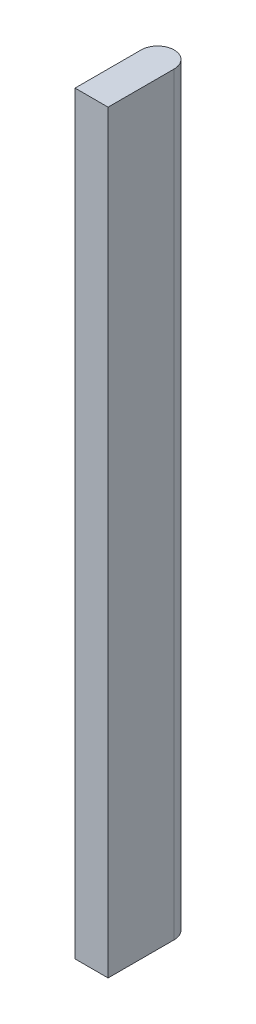
ISO-10303-21;
HEADER;
FILE_DESCRIPTION(('STEP AP214'),'2;1');
FILE_NAME('part.step','',(''),(''),'','','');
FILE_SCHEMA(('AUTOMOTIVE_DESIGN { 1 0 10303 214 1 1 1 1 }'));
ENDSEC;
DATA;
#1=APPLICATION_CONTEXT('core data for automotive mechanical design processes');
#2=APPLICATION_PROTOCOL_DEFINITION('international standard','automotive_design',2000,#1);
#3=PRODUCT_CONTEXT('',#1,'mechanical');
#4=PRODUCT('Part','Part','',(#3));
#5=PRODUCT_RELATED_PRODUCT_CATEGORY('part','',(#4));
#6=PRODUCT_DEFINITION_FORMATION('','',#4);
#7=PRODUCT_DEFINITION_CONTEXT('part definition',#1,'design');
#8=PRODUCT_DEFINITION('design','',#6,#7);
#9=PRODUCT_DEFINITION_SHAPE('','',#8);
#10=(LENGTH_UNIT() NAMED_UNIT(*) SI_UNIT(.MILLI.,.METRE.));
#11=(NAMED_UNIT(*) PLANE_ANGLE_UNIT() SI_UNIT($,.RADIAN.));
#12=(NAMED_UNIT(*) SI_UNIT($,.STERADIAN.) SOLID_ANGLE_UNIT());
#13=UNCERTAINTY_MEASURE_WITH_UNIT(LENGTH_MEASURE(1.E-05),#10,'distance_accuracy_value','');
#14=(GEOMETRIC_REPRESENTATION_CONTEXT(3) GLOBAL_UNCERTAINTY_ASSIGNED_CONTEXT((#13)) GLOBAL_UNIT_ASSIGNED_CONTEXT((#10,
#11,#12)) REPRESENTATION_CONTEXT('',''));
#15=CARTESIAN_POINT('',(0.,0.,0.));
#16=DIRECTION('',(0.,0.,1.));
#17=DIRECTION('',(1.,0.,0.));
#18=AXIS2_PLACEMENT_3D('',#15,#16,#17);
#19=CARTESIAN_POINT('',(0.,145.,0.));
#20=DIRECTION('',(1.,0.,0.));
#21=DIRECTION('',(0.,0.,-1.));
#22=AXIS2_PLACEMENT_3D('',#19,#20,#21);
#23=PLANE('',#22);
#24=DIRECTION('',(0.,0.,1.));
#25=VECTOR('',#24,1.);
#26=CARTESIAN_POINT('',(0.,0.,0.));
#27=LINE('',#26,#25);
#28=CARTESIAN_POINT('',(0.,0.,-12.705));
#29=VERTEX_POINT('',#28);
#30=CARTESIAN_POINT('',(0.,0.,0.));
#31=VERTEX_POINT('',#30);
#32=EDGE_CURVE('E118',#29,#31,#27,.T.);
#33=ORIENTED_EDGE('',*,*,#32,.T.);
#34=DIRECTION('',(0.,-1.,0.));
#35=VECTOR('',#34,1.);
#36=CARTESIAN_POINT('',(0.,145.,0.));
#37=LINE('',#36,#35);
#38=CARTESIAN_POINT('',(0.,145.,0.));
#39=VERTEX_POINT('',#38);
#40=EDGE_CURVE('E11',#39,#31,#37,.T.);
#41=ORIENTED_EDGE('',*,*,#40,.F.);
#42=DIRECTION('',(0.,0.,1.));
#43=VECTOR('',#42,1.);
#44=CARTESIAN_POINT('',(0.,145.,0.));
#45=LINE('',#44,#43);
#46=CARTESIAN_POINT('',(0.,145.,-12.705));
#47=VERTEX_POINT('',#46);
#48=EDGE_CURVE('E128',#47,#39,#45,.T.);
#49=ORIENTED_EDGE('',*,*,#48,.F.);
#50=DIRECTION('',(0.,-1.,0.));
#51=VECTOR('',#50,1.);
#52=CARTESIAN_POINT('',(0.,145.,-12.705));
#53=LINE('',#52,#51);
#54=EDGE_CURVE('E114',#47,#29,#53,.T.);
#55=ORIENTED_EDGE('',*,*,#54,.T.);
#56=EDGE_LOOP('',(#33,#41,#49,#55));
#57=FACE_BOUND('',#56,.T.);
#58=ADVANCED_FACE('F34',(#57),#23,.F.);
#59=CARTESIAN_POINT('',(0.,145.,0.));
#60=DIRECTION('',(0.,0.,-1.));
#61=DIRECTION('',(-1.,0.,0.));
#62=AXIS2_PLACEMENT_3D('',#59,#60,#61);
#63=PLANE('',#62);
#64=DIRECTION('',(1.,0.,0.));
#65=VECTOR('',#64,1.);
#66=CARTESIAN_POINT('',(0.,0.,0.));
#67=LINE('',#66,#65);
#68=CARTESIAN_POINT('',(6.35,0.,0.));
#69=VERTEX_POINT('',#68);
#70=EDGE_CURVE('E121',#31,#69,#67,.T.);
#71=ORIENTED_EDGE('',*,*,#70,.T.);
#72=DIRECTION('',(0.,-1.,0.));
#73=VECTOR('',#72,1.);
#74=CARTESIAN_POINT('',(6.35,145.,0.));
#75=LINE('',#74,#73);
#76=CARTESIAN_POINT('',(6.35,145.,0.));
#77=VERTEX_POINT('',#76);
#78=EDGE_CURVE('E42',#77,#69,#75,.T.);
#79=ORIENTED_EDGE('',*,*,#78,.F.);
#80=DIRECTION('',(1.,0.,0.));
#81=VECTOR('',#80,1.);
#82=CARTESIAN_POINT('',(0.,145.,0.));
#83=LINE('',#82,#81);
#84=EDGE_CURVE('E87',#39,#77,#83,.T.);
#85=ORIENTED_EDGE('',*,*,#84,.F.);
#86=ORIENTED_EDGE('',*,*,#40,.T.);
#87=EDGE_LOOP('',(#71,#79,#85,#86));
#88=FACE_BOUND('',#87,.T.);
#89=ADVANCED_FACE('F152',(#88),#63,.F.);
#90=CARTESIAN_POINT('',(6.35,145.,0.));
#91=DIRECTION('',(-1.,0.,0.));
#92=DIRECTION('',(0.,0.,1.));
#93=AXIS2_PLACEMENT_3D('',#90,#91,#92);
#94=PLANE('',#93);
#95=DIRECTION('',(0.,0.,-1.));
#96=VECTOR('',#95,1.);
#97=CARTESIAN_POINT('',(6.35,0.,0.));
#98=LINE('',#97,#96);
#99=CARTESIAN_POINT('',(6.35,0.,-12.705));
#100=VERTEX_POINT('',#99);
#101=EDGE_CURVE('E123',#69,#100,#98,.T.);
#102=ORIENTED_EDGE('',*,*,#101,.T.);
#103=DIRECTION('',(0.,-1.,0.));
#104=VECTOR('',#103,1.);
#105=CARTESIAN_POINT('',(6.35,145.,-12.705));
#106=LINE('',#105,#104);
#107=CARTESIAN_POINT('',(6.35,145.,-12.705));
#108=VERTEX_POINT('',#107);
#109=EDGE_CURVE('E109',#108,#100,#106,.T.);
#110=ORIENTED_EDGE('',*,*,#109,.F.);
#111=DIRECTION('',(0.,0.,-1.));
#112=VECTOR('',#111,1.);
#113=CARTESIAN_POINT('',(6.35,145.,0.));
#114=LINE('',#113,#112);
#115=EDGE_CURVE('E100',#77,#108,#114,.T.);
#116=ORIENTED_EDGE('',*,*,#115,.F.);
#117=ORIENTED_EDGE('',*,*,#78,.T.);
#118=EDGE_LOOP('',(#102,#110,#116,#117));
#119=FACE_BOUND('',#118,.T.);
#120=ADVANCED_FACE('F134',(#119),#94,.F.);
#121=CARTESIAN_POINT('',(3.18,145.,-12.705));
#122=DIRECTION('',(0.,-1.,0.));
#123=DIRECTION('',(0.,0.,-1.));
#124=AXIS2_PLACEMENT_3D('',#121,#122,#123);
#125=CYLINDRICAL_SURFACE('',#124,3.17);
#126=CARTESIAN_POINT('',(3.18,0.,-12.705));
#127=DIRECTION('',(0.,1.,0.));
#128=DIRECTION('',(0.,0.,-1.));
#129=AXIS2_PLACEMENT_3D('',#126,#127,#128);
#130=CIRCLE('',#129,3.17);
#131=CARTESIAN_POINT('',(3.17999999999997,0.,-15.875));
#132=VERTEX_POINT('',#131);
#133=EDGE_CURVE('E108',#100,#132,#130,.T.);
#134=ORIENTED_EDGE('',*,*,#133,.T.);
#135=DIRECTION('',(0.,-1.,0.));
#136=VECTOR('',#135,1.);
#137=CARTESIAN_POINT('',(3.17999999999997,145.,-15.875));
#138=LINE('',#137,#136);
#139=CARTESIAN_POINT('',(3.17999999999997,145.,-15.875));
#140=VERTEX_POINT('',#139);
#141=EDGE_CURVE('E105',#140,#132,#138,.T.);
#142=ORIENTED_EDGE('',*,*,#141,.F.);
#143=CARTESIAN_POINT('',(3.18,145.,-12.705));
#144=DIRECTION('',(0.,1.,0.));
#145=DIRECTION('',(0.,0.,-1.));
#146=AXIS2_PLACEMENT_3D('',#143,#144,#145);
#147=CIRCLE('',#146,3.17);
#148=EDGE_CURVE('E94',#108,#140,#147,.T.);
#149=ORIENTED_EDGE('',*,*,#148,.F.);
#150=ORIENTED_EDGE('',*,*,#109,.T.);
#151=EDGE_LOOP('',(#134,#142,#149,#150));
#152=FACE_BOUND('',#151,.T.);
#153=ADVANCED_FACE('F106',(#152),#125,.T.);
#154=CARTESIAN_POINT('',(3.17000000000002,145.,-15.875));
#155=DIRECTION('',(0.,0.,1.));
#156=DIRECTION('',(1.,0.,0.));
#157=AXIS2_PLACEMENT_3D('',#154,#155,#156);
#158=PLANE('',#157);
#159=DIRECTION('',(-1.,0.,0.));
#160=VECTOR('',#159,1.);
#161=CARTESIAN_POINT('',(3.17000000000002,0.,-15.875));
#162=LINE('',#161,#160);
#163=CARTESIAN_POINT('',(3.17000000000002,0.,-15.875));
#164=VERTEX_POINT('',#163);
#165=EDGE_CURVE('E73',#132,#164,#162,.T.);
#166=ORIENTED_EDGE('',*,*,#165,.T.);
#167=DIRECTION('',(0.,-1.,0.));
#168=VECTOR('',#167,1.);
#169=CARTESIAN_POINT('',(3.17000000000002,145.,-15.875));
#170=LINE('',#169,#168);
#171=CARTESIAN_POINT('',(3.17000000000002,145.,-15.875));
#172=VERTEX_POINT('',#171);
#173=EDGE_CURVE('E110',#172,#164,#170,.T.);
#174=ORIENTED_EDGE('',*,*,#173,.F.);
#175=DIRECTION('',(-1.,0.,0.));
#176=VECTOR('',#175,1.);
#177=CARTESIAN_POINT('',(3.17000000000002,145.,-15.875));
#178=LINE('',#177,#176);
#179=EDGE_CURVE('E98',#140,#172,#178,.T.);
#180=ORIENTED_EDGE('',*,*,#179,.F.);
#181=ORIENTED_EDGE('',*,*,#141,.T.);
#182=EDGE_LOOP('',(#166,#174,#180,#181));
#183=FACE_BOUND('',#182,.T.);
#184=ADVANCED_FACE('F112',(#183),#158,.F.);
#185=CARTESIAN_POINT('',(3.17,145.,-12.705));
#186=DIRECTION('',(0.,-1.,0.));
#187=DIRECTION('',(0.,0.,-1.));
#188=AXIS2_PLACEMENT_3D('',#185,#186,#187);
#189=CYLINDRICAL_SURFACE('',#188,3.17);
#190=CARTESIAN_POINT('',(3.17,0.,-12.705));
#191=DIRECTION('',(0.,1.,0.));
#192=DIRECTION('',(0.,0.,-1.));
#193=AXIS2_PLACEMENT_3D('',#190,#191,#192);
#194=CIRCLE('',#193,3.17);
#195=EDGE_CURVE('E79',#164,#29,#194,.T.);
#196=ORIENTED_EDGE('',*,*,#195,.T.);
#197=ORIENTED_EDGE('',*,*,#54,.F.);
#198=CARTESIAN_POINT('',(3.17,145.,-12.705));
#199=DIRECTION('',(0.,1.,0.));
#200=DIRECTION('',(0.,0.,-1.));
#201=AXIS2_PLACEMENT_3D('',#198,#199,#200);
#202=CIRCLE('',#201,3.17);
#203=EDGE_CURVE('E50',#172,#47,#202,.T.);
#204=ORIENTED_EDGE('',*,*,#203,.F.);
#205=ORIENTED_EDGE('',*,*,#173,.T.);
#206=EDGE_LOOP('',(#196,#197,#204,#205));
#207=FACE_BOUND('',#206,.T.);
#208=ADVANCED_FACE('F141',(#207),#189,.T.);
#209=CARTESIAN_POINT('',(3.17,145.,-12.705));
#210=DIRECTION('',(0.,-1.,0.));
#211=DIRECTION('',(0.,0.,-1.));
#212=AXIS2_PLACEMENT_3D('',#209,#210,#211);
#213=PLANE('',#212);
#214=ORIENTED_EDGE('',*,*,#48,.T.);
#215=ORIENTED_EDGE('',*,*,#84,.T.);
#216=ORIENTED_EDGE('',*,*,#115,.T.);
#217=ORIENTED_EDGE('',*,*,#148,.T.);
#218=ORIENTED_EDGE('',*,*,#179,.T.);
#219=ORIENTED_EDGE('',*,*,#203,.T.);
#220=EDGE_LOOP('',(#214,#215,#216,#217,#218,#219));
#221=FACE_BOUND('',#220,.T.);
#222=ADVANCED_FACE('F96',(#221),#213,.F.);
#223=CARTESIAN_POINT('',(3.17,0.,-12.705));
#224=DIRECTION('',(0.,-1.,0.));
#225=DIRECTION('',(0.,0.,-1.));
#226=AXIS2_PLACEMENT_3D('',#223,#224,#225);
#227=PLANE('',#226);
#228=ORIENTED_EDGE('',*,*,#32,.F.);
#229=ORIENTED_EDGE('',*,*,#195,.F.);
#230=ORIENTED_EDGE('',*,*,#165,.F.);
#231=ORIENTED_EDGE('',*,*,#133,.F.);
#232=ORIENTED_EDGE('',*,*,#101,.F.);
#233=ORIENTED_EDGE('',*,*,#70,.F.);
#234=EDGE_LOOP('',(#228,#229,#230,#231,#232,#233));
#235=FACE_BOUND('',#234,.T.);
#236=ADVANCED_FACE('F137',(#235),#227,.T.);
#237=CLOSED_SHELL('',(#58,#89,#120,#153,#184,#208,#222,#236));
#238=MANIFOLD_SOLID_BREP('B2',#237);
#239=ADVANCED_BREP_SHAPE_REPRESENTATION('',(#18,#238),#14);
#240=SHAPE_DEFINITION_REPRESENTATION(#9,#239);
ENDSEC;
END-ISO-10303-21;
